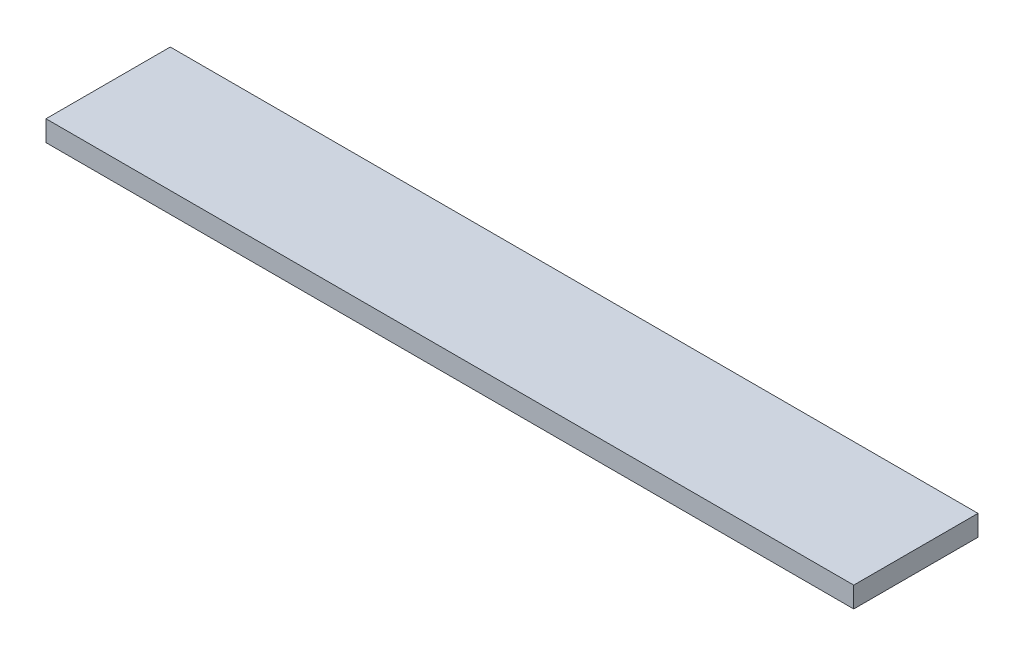
ISO-10303-21;
HEADER;
FILE_DESCRIPTION(('STEP AP214'),'2;1');
FILE_NAME('part.step','',(''),(''),'','','');
FILE_SCHEMA(('AUTOMOTIVE_DESIGN { 1 0 10303 214 1 1 1 1 }'));
ENDSEC;
DATA;
#1=APPLICATION_CONTEXT('core data for automotive mechanical design processes');
#2=APPLICATION_PROTOCOL_DEFINITION('international standard','automotive_design',2000,#1);
#3=PRODUCT_CONTEXT('',#1,'mechanical');
#4=PRODUCT('Part','Part','',(#3));
#5=PRODUCT_RELATED_PRODUCT_CATEGORY('part','',(#4));
#6=PRODUCT_DEFINITION_FORMATION('','',#4);
#7=PRODUCT_DEFINITION_CONTEXT('part definition',#1,'design');
#8=PRODUCT_DEFINITION('design','',#6,#7);
#9=PRODUCT_DEFINITION_SHAPE('','',#8);
#10=(LENGTH_UNIT() NAMED_UNIT(*) SI_UNIT(.MILLI.,.METRE.));
#11=(NAMED_UNIT(*) PLANE_ANGLE_UNIT() SI_UNIT($,.RADIAN.));
#12=(NAMED_UNIT(*) SI_UNIT($,.STERADIAN.) SOLID_ANGLE_UNIT());
#13=UNCERTAINTY_MEASURE_WITH_UNIT(LENGTH_MEASURE(1.E-05),#10,'distance_accuracy_value','');
#14=(GEOMETRIC_REPRESENTATION_CONTEXT(3) GLOBAL_UNCERTAINTY_ASSIGNED_CONTEXT((#13)) GLOBAL_UNIT_ASSIGNED_CONTEXT((#10,
#11,#12)) REPRESENTATION_CONTEXT('',''));
#15=CARTESIAN_POINT('',(0.,0.,0.));
#16=DIRECTION('',(0.,0.,1.));
#17=DIRECTION('',(1.,0.,0.));
#18=AXIS2_PLACEMENT_3D('',#15,#16,#17);
#19=CARTESIAN_POINT('',(-49.53,2.54,-11.8495535714286));
#20=DIRECTION('',(1.,0.,0.));
#21=DIRECTION('',(0.,0.,-1.));
#22=AXIS2_PLACEMENT_3D('',#19,#20,#21);
#23=PLANE('',#22);
#24=DIRECTION('',(0.,0.,1.));
#25=VECTOR('',#24,1.);
#26=CARTESIAN_POINT('',(-49.53,0.,-11.8495535714286));
#27=LINE('',#26,#25);
#28=CARTESIAN_POINT('',(-49.53,0.,-11.8495535714286));
#29=VERTEX_POINT('',#28);
#30=CARTESIAN_POINT('',(-49.53,0.,3.39044642857144));
#31=VERTEX_POINT('',#30);
#32=EDGE_CURVE('E98',#29,#31,#27,.T.);
#33=ORIENTED_EDGE('',*,*,#32,.T.);
#34=DIRECTION('',(0.,-1.,0.));
#35=VECTOR('',#34,1.);
#36=CARTESIAN_POINT('',(-49.53,2.54,3.39044642857144));
#37=LINE('',#36,#35);
#38=CARTESIAN_POINT('',(-49.53,2.54,3.39044642857144));
#39=VERTEX_POINT('',#38);
#40=EDGE_CURVE('E11',#39,#31,#37,.T.);
#41=ORIENTED_EDGE('',*,*,#40,.F.);
#42=DIRECTION('',(0.,0.,1.));
#43=VECTOR('',#42,1.);
#44=CARTESIAN_POINT('',(-49.53,2.54,-11.8495535714286));
#45=LINE('',#44,#43);
#46=CARTESIAN_POINT('',(-49.53,2.54,-11.8495535714286));
#47=VERTEX_POINT('',#46);
#48=EDGE_CURVE('E86',#47,#39,#45,.T.);
#49=ORIENTED_EDGE('',*,*,#48,.F.);
#50=DIRECTION('',(0.,-1.,0.));
#51=VECTOR('',#50,1.);
#52=CARTESIAN_POINT('',(-49.53,2.54,-11.8495535714286));
#53=LINE('',#52,#51);
#54=EDGE_CURVE('E94',#47,#29,#53,.T.);
#55=ORIENTED_EDGE('',*,*,#54,.T.);
#56=EDGE_LOOP('',(#33,#41,#49,#55));
#57=FACE_BOUND('',#56,.T.);
#58=ADVANCED_FACE('F35',(#57),#23,.F.);
#59=CARTESIAN_POINT('',(-49.53,2.54,3.39044642857144));
#60=DIRECTION('',(0.,0.,-1.));
#61=DIRECTION('',(-1.,0.,0.));
#62=AXIS2_PLACEMENT_3D('',#59,#60,#61);
#63=PLANE('',#62);
#64=DIRECTION('',(1.,0.,0.));
#65=VECTOR('',#64,1.);
#66=CARTESIAN_POINT('',(-49.53,0.,3.39044642857144));
#67=LINE('',#66,#65);
#68=CARTESIAN_POINT('',(49.53,0.,3.39044642857144));
#69=VERTEX_POINT('',#68);
#70=EDGE_CURVE('E90',#31,#69,#67,.T.);
#71=ORIENTED_EDGE('',*,*,#70,.T.);
#72=DIRECTION('',(0.,-1.,0.));
#73=VECTOR('',#72,1.);
#74=CARTESIAN_POINT('',(49.53,2.54,3.39044642857144));
#75=LINE('',#74,#73);
#76=CARTESIAN_POINT('',(49.53,2.54,3.39044642857144));
#77=VERTEX_POINT('',#76);
#78=EDGE_CURVE('E43',#77,#69,#75,.T.);
#79=ORIENTED_EDGE('',*,*,#78,.F.);
#80=DIRECTION('',(1.,0.,0.));
#81=VECTOR('',#80,1.);
#82=CARTESIAN_POINT('',(-49.53,2.54,3.39044642857144));
#83=LINE('',#82,#81);
#84=EDGE_CURVE('E81',#39,#77,#83,.T.);
#85=ORIENTED_EDGE('',*,*,#84,.F.);
#86=ORIENTED_EDGE('',*,*,#40,.T.);
#87=EDGE_LOOP('',(#71,#79,#85,#86));
#88=FACE_BOUND('',#87,.T.);
#89=ADVANCED_FACE('F89',(#88),#63,.F.);
#90=CARTESIAN_POINT('',(49.53,2.54,-11.8495535714286));
#91=DIRECTION('',(-1.,0.,0.));
#92=DIRECTION('',(0.,0.,1.));
#93=AXIS2_PLACEMENT_3D('',#90,#91,#92);
#94=PLANE('',#93);
#95=DIRECTION('',(0.,0.,-1.));
#96=VECTOR('',#95,1.);
#97=CARTESIAN_POINT('',(49.53,0.,-11.8495535714286));
#98=LINE('',#97,#96);
#99=CARTESIAN_POINT('',(49.53,0.,-11.8495535714286));
#100=VERTEX_POINT('',#99);
#101=EDGE_CURVE('E68',#69,#100,#98,.T.);
#102=ORIENTED_EDGE('',*,*,#101,.T.);
#103=DIRECTION('',(0.,-1.,0.));
#104=VECTOR('',#103,1.);
#105=CARTESIAN_POINT('',(49.53,2.54,-11.8495535714286));
#106=LINE('',#105,#104);
#107=CARTESIAN_POINT('',(49.53,2.54,-11.8495535714286));
#108=VERTEX_POINT('',#107);
#109=EDGE_CURVE('E91',#108,#100,#106,.T.);
#110=ORIENTED_EDGE('',*,*,#109,.F.);
#111=DIRECTION('',(0.,0.,-1.));
#112=VECTOR('',#111,1.);
#113=CARTESIAN_POINT('',(49.53,2.54,-11.8495535714286));
#114=LINE('',#113,#112);
#115=EDGE_CURVE('E84',#77,#108,#114,.T.);
#116=ORIENTED_EDGE('',*,*,#115,.F.);
#117=ORIENTED_EDGE('',*,*,#78,.T.);
#118=EDGE_LOOP('',(#102,#110,#116,#117));
#119=FACE_BOUND('',#118,.T.);
#120=ADVANCED_FACE('F92',(#119),#94,.F.);
#121=CARTESIAN_POINT('',(-49.53,2.54,-11.8495535714286));
#122=DIRECTION('',(0.,0.,1.));
#123=DIRECTION('',(1.,0.,0.));
#124=AXIS2_PLACEMENT_3D('',#121,#122,#123);
#125=PLANE('',#124);
#126=DIRECTION('',(-1.,0.,0.));
#127=VECTOR('',#126,1.);
#128=CARTESIAN_POINT('',(-49.53,0.,-11.8495535714286));
#129=LINE('',#128,#127);
#130=EDGE_CURVE('E74',#100,#29,#129,.T.);
#131=ORIENTED_EDGE('',*,*,#130,.T.);
#132=ORIENTED_EDGE('',*,*,#54,.F.);
#133=DIRECTION('',(-1.,0.,0.));
#134=VECTOR('',#133,1.);
#135=CARTESIAN_POINT('',(-49.53,2.54,-11.8495535714286));
#136=LINE('',#135,#134);
#137=EDGE_CURVE('E51',#108,#47,#136,.T.);
#138=ORIENTED_EDGE('',*,*,#137,.F.);
#139=ORIENTED_EDGE('',*,*,#109,.T.);
#140=EDGE_LOOP('',(#131,#132,#138,#139));
#141=FACE_BOUND('',#140,.T.);
#142=ADVANCED_FACE('F105',(#141),#125,.F.);
#143=CARTESIAN_POINT('',(0.,2.54,0.));
#144=DIRECTION('',(0.,1.,0.));
#145=DIRECTION('',(0.,0.,1.));
#146=AXIS2_PLACEMENT_3D('',#143,#144,#145);
#147=PLANE('',#146);
#148=ORIENTED_EDGE('',*,*,#48,.T.);
#149=ORIENTED_EDGE('',*,*,#84,.T.);
#150=ORIENTED_EDGE('',*,*,#115,.T.);
#151=ORIENTED_EDGE('',*,*,#137,.T.);
#152=EDGE_LOOP('',(#148,#149,#150,#151));
#153=FACE_BOUND('',#152,.T.);
#154=ADVANCED_FACE('F82',(#153),#147,.T.);
#155=CARTESIAN_POINT('',(0.,0.,0.));
#156=DIRECTION('',(0.,1.,0.));
#157=DIRECTION('',(0.,0.,1.));
#158=AXIS2_PLACEMENT_3D('',#155,#156,#157);
#159=PLANE('',#158);
#160=ORIENTED_EDGE('',*,*,#32,.F.);
#161=ORIENTED_EDGE('',*,*,#130,.F.);
#162=ORIENTED_EDGE('',*,*,#101,.F.);
#163=ORIENTED_EDGE('',*,*,#70,.F.);
#164=EDGE_LOOP('',(#160,#161,#162,#163));
#165=FACE_BOUND('',#164,.T.);
#166=ADVANCED_FACE('F108',(#165),#159,.F.);
#167=CLOSED_SHELL('',(#58,#89,#120,#142,#154,#166));
#168=MANIFOLD_SOLID_BREP('B2',#167);
#169=ADVANCED_BREP_SHAPE_REPRESENTATION('',(#18,#168),#14);
#170=SHAPE_DEFINITION_REPRESENTATION(#9,#169);
ENDSEC;
END-ISO-10303-21;
